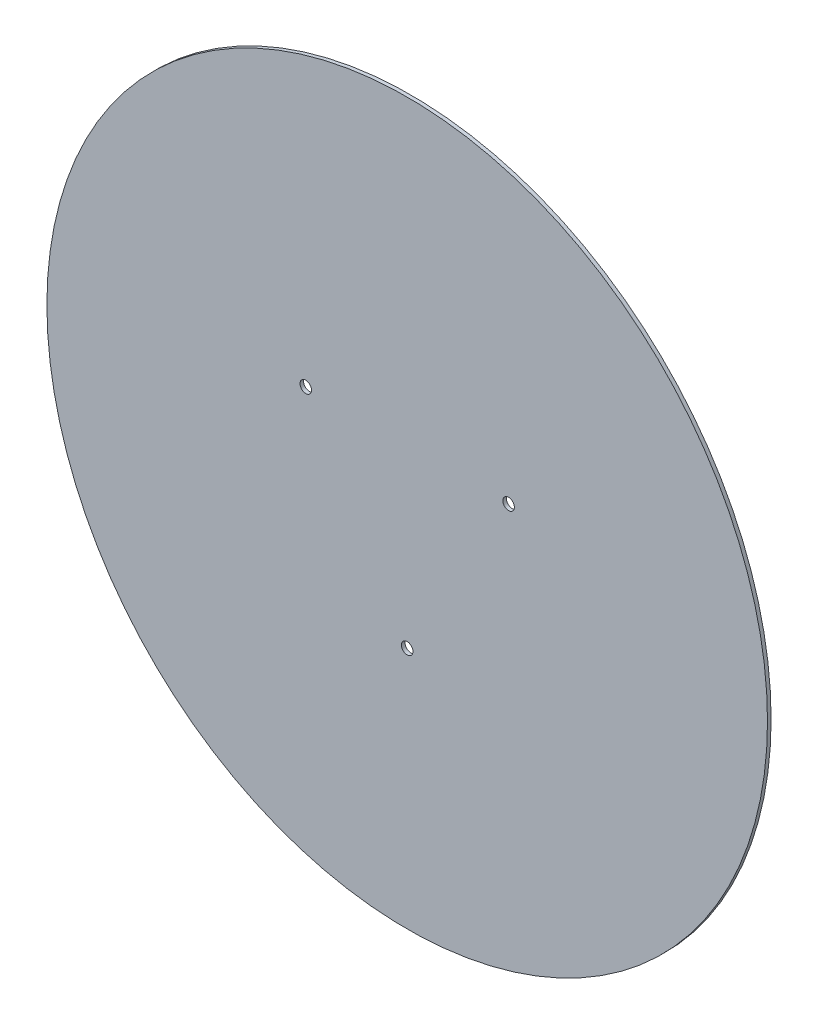
ISO-10303-21;
HEADER;
FILE_DESCRIPTION(('STEP AP214'),'2;1');
FILE_NAME('part.step','',(''),(''),'','','');
FILE_SCHEMA(('AUTOMOTIVE_DESIGN { 1 0 10303 214 1 1 1 1 }'));
ENDSEC;
DATA;
#1=APPLICATION_CONTEXT('core data for automotive mechanical design processes');
#2=APPLICATION_PROTOCOL_DEFINITION('international standard','automotive_design',2000,#1);
#3=PRODUCT_CONTEXT('',#1,'mechanical');
#4=PRODUCT('Part','Part','',(#3));
#5=PRODUCT_RELATED_PRODUCT_CATEGORY('part','',(#4));
#6=PRODUCT_DEFINITION_FORMATION('','',#4);
#7=PRODUCT_DEFINITION_CONTEXT('part definition',#1,'design');
#8=PRODUCT_DEFINITION('design','',#6,#7);
#9=PRODUCT_DEFINITION_SHAPE('','',#8);
#10=(LENGTH_UNIT() NAMED_UNIT(*) SI_UNIT(.MILLI.,.METRE.));
#11=(NAMED_UNIT(*) PLANE_ANGLE_UNIT() SI_UNIT($,.RADIAN.));
#12=(NAMED_UNIT(*) SI_UNIT($,.STERADIAN.) SOLID_ANGLE_UNIT());
#13=UNCERTAINTY_MEASURE_WITH_UNIT(LENGTH_MEASURE(1.E-05),#10,'distance_accuracy_value','');
#14=(GEOMETRIC_REPRESENTATION_CONTEXT(3) GLOBAL_UNCERTAINTY_ASSIGNED_CONTEXT((#13)) GLOBAL_UNIT_ASSIGNED_CONTEXT((#10,
#11,#12)) REPRESENTATION_CONTEXT('',''));
#15=CARTESIAN_POINT('',(0.,0.,0.));
#16=DIRECTION('',(0.,0.,1.));
#17=DIRECTION('',(1.,0.,0.));
#18=AXIS2_PLACEMENT_3D('',#15,#16,#17);
#19=CARTESIAN_POINT('',(-3.30245E-12,0.,0.));
#20=DIRECTION('',(0.,0.,-1.));
#21=DIRECTION('',(-1.,0.,0.));
#22=AXIS2_PLACEMENT_3D('',#19,#20,#21);
#23=PLANE('',#22);
#24=CARTESIAN_POINT('',(-3.30643E-12,-32.5,0.));
#25=DIRECTION('',(0.,0.,-1.));
#26=DIRECTION('',(-1.,0.,0.));
#27=AXIS2_PLACEMENT_3D('',#24,#25,#26);
#28=CIRCLE('',#27,1.6);
#29=CARTESIAN_POINT('',(-1.60000000000331,-32.5,0.));
#30=VERTEX_POINT('',#29);
#31=EDGE_CURVE('E35',#30,#30,#28,.F.);
#32=ORIENTED_EDGE('',*,*,#31,.T.);
#33=EDGE_LOOP('',(#32));
#34=FACE_BOUND('',#33,.T.);
#35=CARTESIAN_POINT('',(-28.1458256229976,16.25,0.));
#36=DIRECTION('',(0.,0.,-1.));
#37=DIRECTION('',(-1.,0.,0.));
#38=AXIS2_PLACEMENT_3D('',#35,#36,#37);
#39=CIRCLE('',#38,1.6);
#40=CARTESIAN_POINT('',(-29.7458256229976,16.25,0.));
#41=VERTEX_POINT('',#40);
#42=EDGE_CURVE('E38',#41,#41,#39,.F.);
#43=ORIENTED_EDGE('',*,*,#42,.T.);
#44=EDGE_LOOP('',(#43));
#45=FACE_BOUND('',#44,.T.);
#46=CARTESIAN_POINT('',(28.1458256229909,16.25,0.));
#47=DIRECTION('',(0.,0.,-1.));
#48=DIRECTION('',(-1.,0.,0.));
#49=AXIS2_PLACEMENT_3D('',#46,#47,#48);
#50=CIRCLE('',#49,1.6);
#51=CARTESIAN_POINT('',(26.5458256229909,16.25,0.));
#52=VERTEX_POINT('',#51);
#53=EDGE_CURVE('E40',#52,#52,#50,.F.);
#54=ORIENTED_EDGE('',*,*,#53,.T.);
#55=EDGE_LOOP('',(#54));
#56=FACE_BOUND('',#55,.T.);
#57=CARTESIAN_POINT('',(-3.30245E-12,0.,0.));
#58=DIRECTION('',(0.,0.,1.));
#59=DIRECTION('',(1.,0.,0.));
#60=AXIS2_PLACEMENT_3D('',#57,#58,#59);
#61=CIRCLE('',#60,100.);
#62=CARTESIAN_POINT('',(99.9999999999967,0.,0.));
#63=VERTEX_POINT('',#62);
#64=EDGE_CURVE('E18',#63,#63,#61,.T.);
#65=ORIENTED_EDGE('',*,*,#64,.F.);
#66=EDGE_LOOP('',(#65));
#67=FACE_BOUND('',#66,.T.);
#68=ADVANCED_FACE('F15',(#34,#45,#56,#67),#23,.T.);
#69=CARTESIAN_POINT('',(-3.30245E-12,0.,0.));
#70=DIRECTION('',(0.,0.,1.));
#71=DIRECTION('',(1.,0.,0.));
#72=AXIS2_PLACEMENT_3D('',#69,#70,#71);
#73=CYLINDRICAL_SURFACE('',#72,100.);
#74=ORIENTED_EDGE('',*,*,#64,.T.);
#75=EDGE_LOOP('',(#74));
#76=FACE_BOUND('',#75,.T.);
#77=CARTESIAN_POINT('',(-3.30245E-12,0.,1.));
#78=DIRECTION('',(0.,0.,1.));
#79=DIRECTION('',(1.,0.,0.));
#80=AXIS2_PLACEMENT_3D('',#77,#78,#79);
#81=CIRCLE('',#80,100.);
#82=CARTESIAN_POINT('',(99.9999999999967,0.,1.));
#83=VERTEX_POINT('',#82);
#84=EDGE_CURVE('E32',#83,#83,#81,.F.);
#85=ORIENTED_EDGE('',*,*,#84,.T.);
#86=EDGE_LOOP('',(#85));
#87=FACE_BOUND('',#86,.T.);
#88=ADVANCED_FACE('F47',(#76,#87),#73,.T.);
#89=CARTESIAN_POINT('',(28.1458256229909,16.25,4.));
#90=DIRECTION('',(0.,0.,-1.));
#91=DIRECTION('',(-1.,0.,0.));
#92=AXIS2_PLACEMENT_3D('',#89,#90,#91);
#93=CYLINDRICAL_SURFACE('',#92,1.6);
#94=ORIENTED_EDGE('',*,*,#53,.F.);
#95=EDGE_LOOP('',(#94));
#96=FACE_BOUND('',#95,.T.);
#97=CARTESIAN_POINT('',(28.1458256229909,16.25,1.));
#98=DIRECTION('',(0.,0.,-1.));
#99=DIRECTION('',(-1.,0.,0.));
#100=AXIS2_PLACEMENT_3D('',#97,#98,#99);
#101=CIRCLE('',#100,1.6);
#102=CARTESIAN_POINT('',(26.5458256229909,16.25,1.));
#103=VERTEX_POINT('',#102);
#104=EDGE_CURVE('E27',#103,#103,#101,.F.);
#105=ORIENTED_EDGE('',*,*,#104,.T.);
#106=EDGE_LOOP('',(#105));
#107=FACE_BOUND('',#106,.T.);
#108=ADVANCED_FACE('F56',(#96,#107),#93,.F.);
#109=CARTESIAN_POINT('',(-28.1458256229976,16.25,4.));
#110=DIRECTION('',(0.,0.,-1.));
#111=DIRECTION('',(-1.,0.,0.));
#112=AXIS2_PLACEMENT_3D('',#109,#110,#111);
#113=CYLINDRICAL_SURFACE('',#112,1.6);
#114=ORIENTED_EDGE('',*,*,#42,.F.);
#115=EDGE_LOOP('',(#114));
#116=FACE_BOUND('',#115,.T.);
#117=CARTESIAN_POINT('',(-28.1458256229976,16.25,1.));
#118=DIRECTION('',(0.,0.,-1.));
#119=DIRECTION('',(-1.,0.,0.));
#120=AXIS2_PLACEMENT_3D('',#117,#118,#119);
#121=CIRCLE('',#120,1.6);
#122=CARTESIAN_POINT('',(-29.7458256229976,16.25,1.));
#123=VERTEX_POINT('',#122);
#124=EDGE_CURVE('E22',#123,#123,#121,.F.);
#125=ORIENTED_EDGE('',*,*,#124,.T.);
#126=EDGE_LOOP('',(#125));
#127=FACE_BOUND('',#126,.T.);
#128=ADVANCED_FACE('F66',(#116,#127),#113,.F.);
#129=CARTESIAN_POINT('',(-3.30643E-12,-32.5,4.));
#130=DIRECTION('',(0.,0.,-1.));
#131=DIRECTION('',(-1.,0.,0.));
#132=AXIS2_PLACEMENT_3D('',#129,#130,#131);
#133=CYLINDRICAL_SURFACE('',#132,1.6);
#134=ORIENTED_EDGE('',*,*,#31,.F.);
#135=EDGE_LOOP('',(#134));
#136=FACE_BOUND('',#135,.T.);
#137=CARTESIAN_POINT('',(-3.30643E-12,-32.5,1.));
#138=DIRECTION('',(0.,0.,-1.));
#139=DIRECTION('',(-1.,0.,0.));
#140=AXIS2_PLACEMENT_3D('',#137,#138,#139);
#141=CIRCLE('',#140,1.6);
#142=CARTESIAN_POINT('',(-1.60000000000331,-32.5,1.));
#143=VERTEX_POINT('',#142);
#144=EDGE_CURVE('E10',#143,#143,#141,.F.);
#145=ORIENTED_EDGE('',*,*,#144,.T.);
#146=EDGE_LOOP('',(#145));
#147=FACE_BOUND('',#146,.T.);
#148=ADVANCED_FACE('F60',(#136,#147),#133,.F.);
#149=CARTESIAN_POINT('',(-3.30245E-12,0.,1.));
#150=DIRECTION('',(0.,0.,-1.));
#151=DIRECTION('',(-1.,0.,0.));
#152=AXIS2_PLACEMENT_3D('',#149,#150,#151);
#153=PLANE('',#152);
#154=ORIENTED_EDGE('',*,*,#144,.F.);
#155=EDGE_LOOP('',(#154));
#156=FACE_BOUND('',#155,.T.);
#157=ORIENTED_EDGE('',*,*,#124,.F.);
#158=EDGE_LOOP('',(#157));
#159=FACE_BOUND('',#158,.T.);
#160=ORIENTED_EDGE('',*,*,#104,.F.);
#161=EDGE_LOOP('',(#160));
#162=FACE_BOUND('',#161,.T.);
#163=ORIENTED_EDGE('',*,*,#84,.F.);
#164=EDGE_LOOP('',(#163));
#165=FACE_BOUND('',#164,.T.);
#166=ADVANCED_FACE('F58',(#156,#159,#162,#165),#153,.F.);
#167=CLOSED_SHELL('',(#68,#88,#108,#128,#148,#166));
#168=MANIFOLD_SOLID_BREP('B1',#167);
#169=ADVANCED_BREP_SHAPE_REPRESENTATION('',(#18,#168),#14);
#170=SHAPE_DEFINITION_REPRESENTATION(#9,#169);
ENDSEC;
END-ISO-10303-21;
